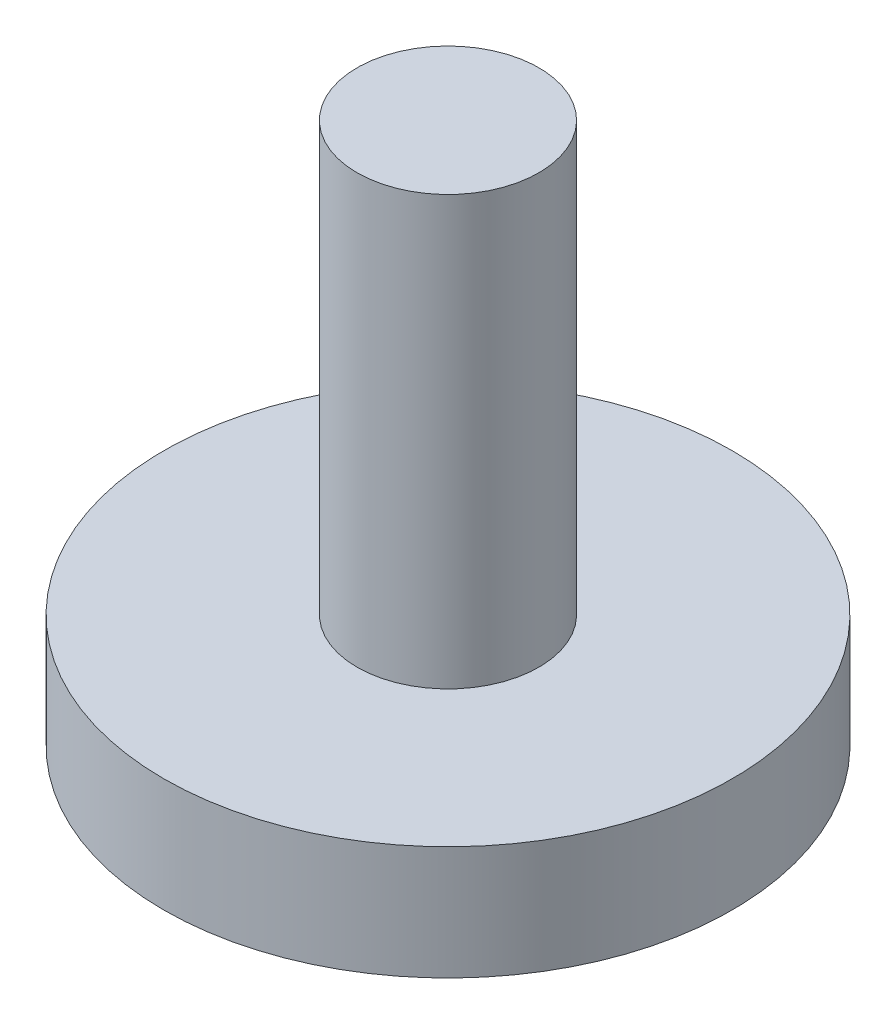
ISO-10303-21;
HEADER;
FILE_DESCRIPTION(('STEP AP214'),'2;1');
FILE_NAME('part.step','',(''),(''),'','','');
FILE_SCHEMA(('AUTOMOTIVE_DESIGN { 1 0 10303 214 1 1 1 1 }'));
ENDSEC;
DATA;
#1=APPLICATION_CONTEXT('core data for automotive mechanical design processes');
#2=APPLICATION_PROTOCOL_DEFINITION('international standard','automotive_design',2000,#1);
#3=PRODUCT_CONTEXT('',#1,'mechanical');
#4=PRODUCT('Part','Part','',(#3));
#5=PRODUCT_RELATED_PRODUCT_CATEGORY('part','',(#4));
#6=PRODUCT_DEFINITION_FORMATION('','',#4);
#7=PRODUCT_DEFINITION_CONTEXT('part definition',#1,'design');
#8=PRODUCT_DEFINITION('design','',#6,#7);
#9=PRODUCT_DEFINITION_SHAPE('','',#8);
#10=(LENGTH_UNIT() NAMED_UNIT(*) SI_UNIT(.MILLI.,.METRE.));
#11=(NAMED_UNIT(*) PLANE_ANGLE_UNIT() SI_UNIT($,.RADIAN.));
#12=(NAMED_UNIT(*) SI_UNIT($,.STERADIAN.) SOLID_ANGLE_UNIT());
#13=UNCERTAINTY_MEASURE_WITH_UNIT(LENGTH_MEASURE(1.E-05),#10,'distance_accuracy_value','');
#14=(GEOMETRIC_REPRESENTATION_CONTEXT(3) GLOBAL_UNCERTAINTY_ASSIGNED_CONTEXT((#13)) GLOBAL_UNIT_ASSIGNED_CONTEXT((#10,
#11,#12)) REPRESENTATION_CONTEXT('',''));
#15=CARTESIAN_POINT('',(0.,0.,0.));
#16=DIRECTION('',(0.,0.,1.));
#17=DIRECTION('',(1.,0.,0.));
#18=AXIS2_PLACEMENT_3D('',#15,#16,#17);
#19=CARTESIAN_POINT('',(0.,3.,0.));
#20=DIRECTION('',(0.,1.,0.));
#21=DIRECTION('',(0.,0.,1.));
#22=AXIS2_PLACEMENT_3D('',#19,#20,#21);
#23=PLANE('',#22);
#24=CARTESIAN_POINT('',(0.,3.,0.));
#25=DIRECTION('',(0.,1.,0.));
#26=DIRECTION('',(0.,0.,1.));
#27=AXIS2_PLACEMENT_3D('',#24,#25,#26);
#28=CIRCLE('',#27,7.5);
#29=CARTESIAN_POINT('',(0.,3.,7.5));
#30=VERTEX_POINT('',#29);
#31=EDGE_CURVE('E10',#30,#30,#28,.T.);
#32=ORIENTED_EDGE('',*,*,#31,.T.);
#33=EDGE_LOOP('',(#32));
#34=FACE_BOUND('',#33,.T.);
#35=CARTESIAN_POINT('',(0.,3.,0.));
#36=DIRECTION('',(0.,1.,0.));
#37=DIRECTION('',(0.,0.,1.));
#38=AXIS2_PLACEMENT_3D('',#35,#36,#37);
#39=CIRCLE('',#38,2.4);
#40=CARTESIAN_POINT('',(0.,3.,2.4));
#41=VERTEX_POINT('',#40);
#42=EDGE_CURVE('E43',#41,#41,#39,.T.);
#43=ORIENTED_EDGE('',*,*,#42,.F.);
#44=EDGE_LOOP('',(#43));
#45=FACE_BOUND('',#44,.T.);
#46=ADVANCED_FACE('F30',(#34,#45),#23,.T.);
#47=CARTESIAN_POINT('',(0.,3.,0.));
#48=DIRECTION('',(0.,-1.,0.));
#49=DIRECTION('',(0.,0.,-1.));
#50=AXIS2_PLACEMENT_3D('',#47,#48,#49);
#51=CYLINDRICAL_SURFACE('',#50,7.5);
#52=ORIENTED_EDGE('',*,*,#31,.F.);
#53=EDGE_LOOP('',(#52));
#54=FACE_BOUND('',#53,.T.);
#55=CARTESIAN_POINT('',(0.,0.,0.));
#56=DIRECTION('',(0.,1.,0.));
#57=DIRECTION('',(0.,0.,1.));
#58=AXIS2_PLACEMENT_3D('',#55,#56,#57);
#59=CIRCLE('',#58,7.5);
#60=CARTESIAN_POINT('',(0.,0.,7.5));
#61=VERTEX_POINT('',#60);
#62=EDGE_CURVE('E34',#61,#61,#59,.T.);
#63=ORIENTED_EDGE('',*,*,#62,.T.);
#64=EDGE_LOOP('',(#63));
#65=FACE_BOUND('',#64,.T.);
#66=ADVANCED_FACE('F32',(#54,#65),#51,.T.);
#67=CARTESIAN_POINT('',(0.,0.,0.));
#68=DIRECTION('',(0.,1.,0.));
#69=DIRECTION('',(0.,0.,1.));
#70=AXIS2_PLACEMENT_3D('',#67,#68,#69);
#71=PLANE('',#70);
#72=ORIENTED_EDGE('',*,*,#62,.F.);
#73=EDGE_LOOP('',(#72));
#74=FACE_BOUND('',#73,.T.);
#75=ADVANCED_FACE('F54',(#74),#71,.F.);
#76=CARTESIAN_POINT('',(0.,14.3,0.));
#77=DIRECTION('',(0.,-1.,0.));
#78=DIRECTION('',(0.,0.,-1.));
#79=AXIS2_PLACEMENT_3D('',#76,#77,#78);
#80=CYLINDRICAL_SURFACE('',#79,2.4);
#81=CARTESIAN_POINT('',(0.,14.3,0.));
#82=DIRECTION('',(0.,1.,0.));
#83=DIRECTION('',(0.,0.,1.));
#84=AXIS2_PLACEMENT_3D('',#81,#82,#83);
#85=CIRCLE('',#84,2.4);
#86=CARTESIAN_POINT('',(0.,14.3,2.4));
#87=VERTEX_POINT('',#86);
#88=EDGE_CURVE('E41',#87,#87,#85,.T.);
#89=ORIENTED_EDGE('',*,*,#88,.F.);
#90=EDGE_LOOP('',(#89));
#91=FACE_BOUND('',#90,.T.);
#92=ORIENTED_EDGE('',*,*,#42,.T.);
#93=EDGE_LOOP('',(#92));
#94=FACE_BOUND('',#93,.T.);
#95=ADVANCED_FACE('F51',(#91,#94),#80,.T.);
#96=CARTESIAN_POINT('',(0.,14.3,0.));
#97=DIRECTION('',(0.,1.,0.));
#98=DIRECTION('',(0.,0.,1.));
#99=AXIS2_PLACEMENT_3D('',#96,#97,#98);
#100=PLANE('',#99);
#101=ORIENTED_EDGE('',*,*,#88,.T.);
#102=EDGE_LOOP('',(#101));
#103=FACE_BOUND('',#102,.T.);
#104=ADVANCED_FACE('F49',(#103),#100,.T.);
#105=CLOSED_SHELL('',(#46,#66,#75,#95,#104));
#106=MANIFOLD_SOLID_BREP('B2',#105);
#107=ADVANCED_BREP_SHAPE_REPRESENTATION('',(#18,#106),#14);
#108=SHAPE_DEFINITION_REPRESENTATION(#9,#107);
ENDSEC;
END-ISO-10303-21;
